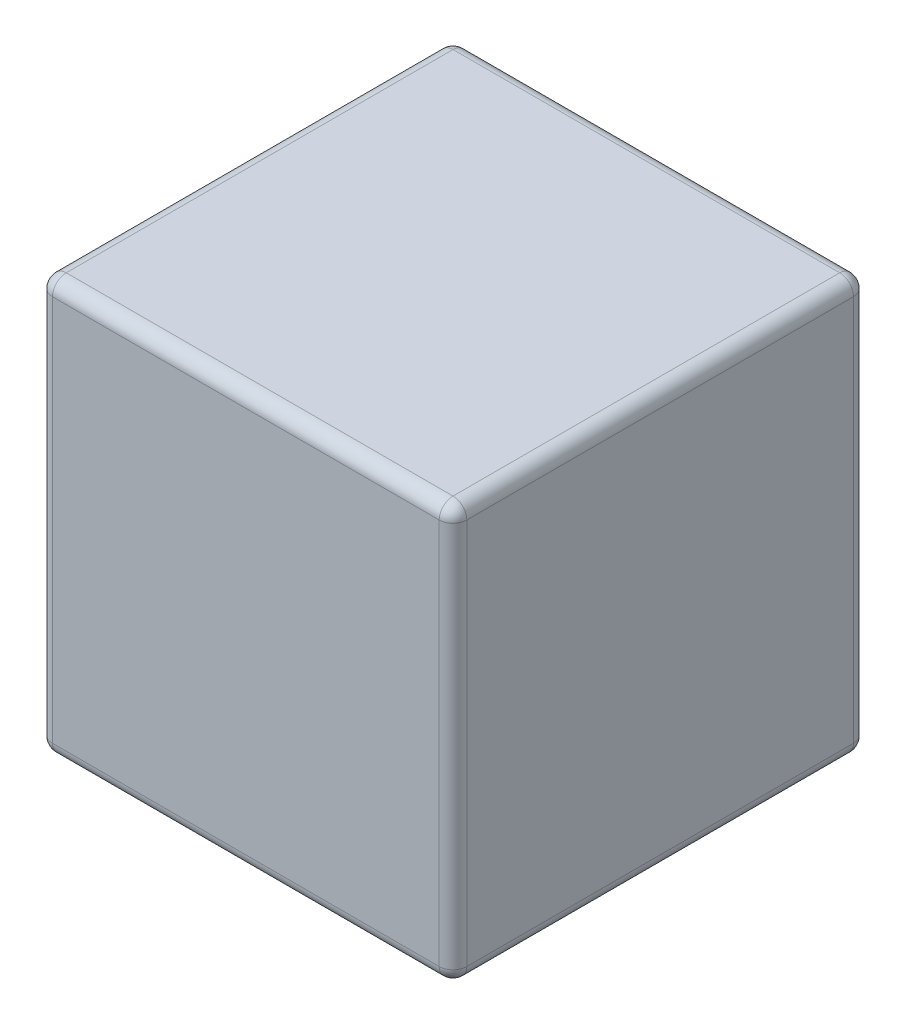
ISO-10303-21;
HEADER;
FILE_DESCRIPTION(('STEP AP214'),'2;1');
FILE_NAME('part.step','',(''),(''),'','','');
FILE_SCHEMA(('AUTOMOTIVE_DESIGN { 1 0 10303 214 1 1 1 1 }'));
ENDSEC;
DATA;
#1=APPLICATION_CONTEXT('core data for automotive mechanical design processes');
#2=APPLICATION_PROTOCOL_DEFINITION('international standard','automotive_design',2000,#1);
#3=PRODUCT_CONTEXT('',#1,'mechanical');
#4=PRODUCT('Part','Part','',(#3));
#5=PRODUCT_RELATED_PRODUCT_CATEGORY('part','',(#4));
#6=PRODUCT_DEFINITION_FORMATION('','',#4);
#7=PRODUCT_DEFINITION_CONTEXT('part definition',#1,'design');
#8=PRODUCT_DEFINITION('design','',#6,#7);
#9=PRODUCT_DEFINITION_SHAPE('','',#8);
#10=(LENGTH_UNIT() NAMED_UNIT(*) SI_UNIT(.MILLI.,.METRE.));
#11=(NAMED_UNIT(*) PLANE_ANGLE_UNIT() SI_UNIT($,.RADIAN.));
#12=(NAMED_UNIT(*) SI_UNIT($,.STERADIAN.) SOLID_ANGLE_UNIT());
#13=UNCERTAINTY_MEASURE_WITH_UNIT(LENGTH_MEASURE(1.E-05),#10,'distance_accuracy_value','');
#14=(GEOMETRIC_REPRESENTATION_CONTEXT(3) GLOBAL_UNCERTAINTY_ASSIGNED_CONTEXT((#13)) GLOBAL_UNIT_ASSIGNED_CONTEXT((#10,
#11,#12)) REPRESENTATION_CONTEXT('',''));
#15=CARTESIAN_POINT('',(0.,0.,0.));
#16=DIRECTION('',(0.,0.,1.));
#17=DIRECTION('',(1.,0.,0.));
#18=AXIS2_PLACEMENT_3D('',#15,#16,#17);
#19=CARTESIAN_POINT('',(15.,15.,30.));
#20=DIRECTION('',(-1.,0.,0.));
#21=DIRECTION('',(0.,-1.,0.));
#22=AXIS2_PLACEMENT_3D('',#19,#20,#21);
#23=PLANE('',#22);
#24=DIRECTION('',(0.,1.,0.));
#25=VECTOR('',#24,1.);
#26=CARTESIAN_POINT('',(15.,-15.,29.));
#27=LINE('',#26,#25);
#28=CARTESIAN_POINT('',(15.,14.,29.));
#29=VERTEX_POINT('',#28);
#30=CARTESIAN_POINT('',(15.,-14.,29.));
#31=VERTEX_POINT('',#30);
#32=EDGE_CURVE('E188',#29,#31,#27,.F.);
#33=ORIENTED_EDGE('',*,*,#32,.T.);
#34=DIRECTION('',(0.,0.,-1.));
#35=VECTOR('',#34,1.);
#36=CARTESIAN_POINT('',(15.,-14.,30.));
#37=LINE('',#36,#35);
#38=CARTESIAN_POINT('',(15.,-14.,1.));
#39=VERTEX_POINT('',#38);
#40=EDGE_CURVE('E190',#31,#39,#37,.T.);
#41=ORIENTED_EDGE('',*,*,#40,.T.);
#42=DIRECTION('',(0.,1.,0.));
#43=VECTOR('',#42,1.);
#44=CARTESIAN_POINT('',(15.,15.,1.));
#45=LINE('',#44,#43);
#46=CARTESIAN_POINT('',(15.,14.,1.));
#47=VERTEX_POINT('',#46);
#48=EDGE_CURVE('E186',#39,#47,#45,.T.);
#49=ORIENTED_EDGE('',*,*,#48,.T.);
#50=DIRECTION('',(0.,0.,-1.));
#51=VECTOR('',#50,1.);
#52=CARTESIAN_POINT('',(15.,14.,30.));
#53=LINE('',#52,#51);
#54=EDGE_CURVE('E184',#47,#29,#53,.F.);
#55=ORIENTED_EDGE('',*,*,#54,.T.);
#56=EDGE_LOOP('',(#33,#41,#49,#55));
#57=FACE_BOUND('',#56,.T.);
#58=ADVANCED_FACE('F32',(#57),#23,.F.);
#59=CARTESIAN_POINT('',(-15.,15.,30.));
#60=DIRECTION('',(0.,-1.,0.));
#61=DIRECTION('',(0.,0.,-1.));
#62=AXIS2_PLACEMENT_3D('',#59,#60,#61);
#63=PLANE('',#62);
#64=DIRECTION('',(-1.,0.,0.));
#65=VECTOR('',#64,1.);
#66=CARTESIAN_POINT('',(15.,15.,29.));
#67=LINE('',#66,#65);
#68=CARTESIAN_POINT('',(-14.,15.,29.));
#69=VERTEX_POINT('',#68);
#70=CARTESIAN_POINT('',(14.,15.,29.));
#71=VERTEX_POINT('',#70);
#72=EDGE_CURVE('E41',#69,#71,#67,.F.);
#73=ORIENTED_EDGE('',*,*,#72,.T.);
#74=DIRECTION('',(0.,0.,-1.));
#75=VECTOR('',#74,1.);
#76=CARTESIAN_POINT('',(14.,15.,30.));
#77=LINE('',#76,#75);
#78=CARTESIAN_POINT('',(14.,15.,1.));
#79=VERTEX_POINT('',#78);
#80=EDGE_CURVE('E11',#71,#79,#77,.T.);
#81=ORIENTED_EDGE('',*,*,#80,.T.);
#82=DIRECTION('',(-1.,0.,0.));
#83=VECTOR('',#82,1.);
#84=CARTESIAN_POINT('',(-15.,15.,1.));
#85=LINE('',#84,#83);
#86=CARTESIAN_POINT('',(-14.,15.,1.));
#87=VERTEX_POINT('',#86);
#88=EDGE_CURVE('E193',#79,#87,#85,.T.);
#89=ORIENTED_EDGE('',*,*,#88,.T.);
#90=DIRECTION('',(0.,0.,-1.));
#91=VECTOR('',#90,1.);
#92=CARTESIAN_POINT('',(-14.,15.,30.));
#93=LINE('',#92,#91);
#94=EDGE_CURVE('E52',#87,#69,#93,.F.);
#95=ORIENTED_EDGE('',*,*,#94,.T.);
#96=EDGE_LOOP('',(#73,#81,#89,#95));
#97=FACE_BOUND('',#96,.T.);
#98=ADVANCED_FACE('F295',(#97),#63,.F.);
#99=CARTESIAN_POINT('',(-15.,15.,30.));
#100=DIRECTION('',(1.,0.,0.));
#101=DIRECTION('',(0.,1.,0.));
#102=AXIS2_PLACEMENT_3D('',#99,#100,#101);
#103=PLANE('',#102);
#104=DIRECTION('',(0.,-1.,0.));
#105=VECTOR('',#104,1.);
#106=CARTESIAN_POINT('',(-15.,15.,1.));
#107=LINE('',#106,#105);
#108=CARTESIAN_POINT('',(-15.,14.,1.));
#109=VERTEX_POINT('',#108);
#110=CARTESIAN_POINT('',(-15.,-14.,1.));
#111=VERTEX_POINT('',#110);
#112=EDGE_CURVE('E170',#109,#111,#107,.T.);
#113=ORIENTED_EDGE('',*,*,#112,.T.);
#114=DIRECTION('',(0.,0.,-1.));
#115=VECTOR('',#114,1.);
#116=CARTESIAN_POINT('',(-15.,-14.,30.));
#117=LINE('',#116,#115);
#118=CARTESIAN_POINT('',(-15.,-14.,29.));
#119=VERTEX_POINT('',#118);
#120=EDGE_CURVE('E172',#111,#119,#117,.F.);
#121=ORIENTED_EDGE('',*,*,#120,.T.);
#122=DIRECTION('',(0.,-1.,0.));
#123=VECTOR('',#122,1.);
#124=CARTESIAN_POINT('',(-15.,15.,29.));
#125=LINE('',#124,#123);
#126=CARTESIAN_POINT('',(-15.,14.,29.));
#127=VERTEX_POINT('',#126);
#128=EDGE_CURVE('E168',#119,#127,#125,.F.);
#129=ORIENTED_EDGE('',*,*,#128,.T.);
#130=DIRECTION('',(0.,0.,-1.));
#131=VECTOR('',#130,1.);
#132=CARTESIAN_POINT('',(-15.,14.,30.));
#133=LINE('',#132,#131);
#134=EDGE_CURVE('E166',#127,#109,#133,.T.);
#135=ORIENTED_EDGE('',*,*,#134,.T.);
#136=EDGE_LOOP('',(#113,#121,#129,#135));
#137=FACE_BOUND('',#136,.T.);
#138=ADVANCED_FACE('F267',(#137),#103,.F.);
#139=CARTESIAN_POINT('',(-15.,-15.,30.));
#140=DIRECTION('',(0.,1.,0.));
#141=DIRECTION('',(0.,0.,1.));
#142=AXIS2_PLACEMENT_3D('',#139,#140,#141);
#143=PLANE('',#142);
#144=DIRECTION('',(0.,0.,-1.));
#145=VECTOR('',#144,1.);
#146=CARTESIAN_POINT('',(-14.,-15.,30.));
#147=LINE('',#146,#145);
#148=CARTESIAN_POINT('',(-14.,-15.,29.));
#149=VERTEX_POINT('',#148);
#150=CARTESIAN_POINT('',(-14.,-15.,1.));
#151=VERTEX_POINT('',#150);
#152=EDGE_CURVE('E153',#149,#151,#147,.T.);
#153=ORIENTED_EDGE('',*,*,#152,.T.);
#154=DIRECTION('',(1.,0.,0.));
#155=VECTOR('',#154,1.);
#156=CARTESIAN_POINT('',(-15.,-15.,1.));
#157=LINE('',#156,#155);
#158=CARTESIAN_POINT('',(14.,-15.,1.));
#159=VERTEX_POINT('',#158);
#160=EDGE_CURVE('E125',#151,#159,#157,.T.);
#161=ORIENTED_EDGE('',*,*,#160,.T.);
#162=DIRECTION('',(0.,0.,-1.));
#163=VECTOR('',#162,1.);
#164=CARTESIAN_POINT('',(14.,-15.,30.));
#165=LINE('',#164,#163);
#166=CARTESIAN_POINT('',(14.,-15.,29.));
#167=VERTEX_POINT('',#166);
#168=EDGE_CURVE('E143',#159,#167,#165,.F.);
#169=ORIENTED_EDGE('',*,*,#168,.T.);
#170=DIRECTION('',(1.,0.,0.));
#171=VECTOR('',#170,1.);
#172=CARTESIAN_POINT('',(-15.,-15.,29.));
#173=LINE('',#172,#171);
#174=EDGE_CURVE('E149',#167,#149,#173,.F.);
#175=ORIENTED_EDGE('',*,*,#174,.T.);
#176=EDGE_LOOP('',(#153,#161,#169,#175));
#177=FACE_BOUND('',#176,.T.);
#178=ADVANCED_FACE('F151',(#177),#143,.F.);
#179=CARTESIAN_POINT('',(0.,0.,30.));
#180=DIRECTION('',(0.,0.,1.));
#181=DIRECTION('',(1.,0.,0.));
#182=AXIS2_PLACEMENT_3D('',#179,#180,#181);
#183=PLANE('',#182);
#184=DIRECTION('',(0.,-1.,0.));
#185=VECTOR('',#184,1.);
#186=CARTESIAN_POINT('',(-14.,-15.,30.));
#187=LINE('',#186,#185);
#188=CARTESIAN_POINT('',(-14.,14.,30.));
#189=VERTEX_POINT('',#188);
#190=CARTESIAN_POINT('',(-14.,-14.,30.));
#191=VERTEX_POINT('',#190);
#192=EDGE_CURVE('E179',#189,#191,#187,.T.);
#193=ORIENTED_EDGE('',*,*,#192,.T.);
#194=DIRECTION('',(1.,0.,0.));
#195=VECTOR('',#194,1.);
#196=CARTESIAN_POINT('',(15.,-14.,30.));
#197=LINE('',#196,#195);
#198=CARTESIAN_POINT('',(14.,-14.,30.));
#199=VERTEX_POINT('',#198);
#200=EDGE_CURVE('E181',#191,#199,#197,.T.);
#201=ORIENTED_EDGE('',*,*,#200,.T.);
#202=DIRECTION('',(0.,1.,0.));
#203=VECTOR('',#202,1.);
#204=CARTESIAN_POINT('',(14.,15.,30.));
#205=LINE('',#204,#203);
#206=CARTESIAN_POINT('',(14.,14.,30.));
#207=VERTEX_POINT('',#206);
#208=EDGE_CURVE('E177',#199,#207,#205,.T.);
#209=ORIENTED_EDGE('',*,*,#208,.T.);
#210=DIRECTION('',(-1.,0.,0.));
#211=VECTOR('',#210,1.);
#212=CARTESIAN_POINT('',(-15.,14.,30.));
#213=LINE('',#212,#211);
#214=EDGE_CURVE('E175',#207,#189,#213,.T.);
#215=ORIENTED_EDGE('',*,*,#214,.T.);
#216=EDGE_LOOP('',(#193,#201,#209,#215));
#217=FACE_BOUND('',#216,.T.);
#218=ADVANCED_FACE('F276',(#217),#183,.T.);
#219=CARTESIAN_POINT('',(0.,0.,0.));
#220=DIRECTION('',(0.,0.,1.));
#221=DIRECTION('',(1.,0.,0.));
#222=AXIS2_PLACEMENT_3D('',#219,#220,#221);
#223=PLANE('',#222);
#224=DIRECTION('',(0.,1.,0.));
#225=VECTOR('',#224,1.);
#226=CARTESIAN_POINT('',(14.,0.,0.));
#227=LINE('',#226,#225);
#228=CARTESIAN_POINT('',(14.,14.,0.));
#229=VERTEX_POINT('',#228);
#230=CARTESIAN_POINT('',(14.,-14.,0.));
#231=VERTEX_POINT('',#230);
#232=EDGE_CURVE('E157',#229,#231,#227,.F.);
#233=ORIENTED_EDGE('',*,*,#232,.T.);
#234=DIRECTION('',(1.,0.,0.));
#235=VECTOR('',#234,1.);
#236=CARTESIAN_POINT('',(0.,-14.,0.));
#237=LINE('',#236,#235);
#238=CARTESIAN_POINT('',(-14.,-14.,0.));
#239=VERTEX_POINT('',#238);
#240=EDGE_CURVE('E127',#231,#239,#237,.F.);
#241=ORIENTED_EDGE('',*,*,#240,.T.);
#242=DIRECTION('',(0.,-1.,0.));
#243=VECTOR('',#242,1.);
#244=CARTESIAN_POINT('',(-14.,0.,0.));
#245=LINE('',#244,#243);
#246=CARTESIAN_POINT('',(-14.,14.,0.));
#247=VERTEX_POINT('',#246);
#248=EDGE_CURVE('E163',#239,#247,#245,.F.);
#249=ORIENTED_EDGE('',*,*,#248,.T.);
#250=DIRECTION('',(-1.,0.,0.));
#251=VECTOR('',#250,1.);
#252=CARTESIAN_POINT('',(0.,14.,0.));
#253=LINE('',#252,#251);
#254=EDGE_CURVE('E155',#247,#229,#253,.F.);
#255=ORIENTED_EDGE('',*,*,#254,.T.);
#256=EDGE_LOOP('',(#233,#241,#249,#255));
#257=FACE_BOUND('',#256,.T.);
#258=ADVANCED_FACE('F355',(#257),#223,.F.);
#259=CARTESIAN_POINT('',(0.,14.,29.));
#260=DIRECTION('',(1.,0.,0.));
#261=DIRECTION('',(0.,0.,-1.));
#262=AXIS2_PLACEMENT_3D('',#259,#260,#261);
#263=CYLINDRICAL_SURFACE('',#262,1.);
#264=CARTESIAN_POINT('',(-14.,14.,29.));
#265=DIRECTION('',(-1.,0.,0.));
#266=DIRECTION('',(0.,0.,1.));
#267=AXIS2_PLACEMENT_3D('',#264,#265,#266);
#268=CIRCLE('',#267,1.);
#269=EDGE_CURVE('E36',#189,#69,#268,.T.);
#270=ORIENTED_EDGE('',*,*,#269,.F.);
#271=ORIENTED_EDGE('',*,*,#214,.F.);
#272=CARTESIAN_POINT('',(14.,14.,29.));
#273=DIRECTION('',(1.,0.,0.));
#274=DIRECTION('',(0.,0.,-1.));
#275=AXIS2_PLACEMENT_3D('',#272,#273,#274);
#276=CIRCLE('',#275,1.);
#277=EDGE_CURVE('E246',#71,#207,#276,.T.);
#278=ORIENTED_EDGE('',*,*,#277,.F.);
#279=ORIENTED_EDGE('',*,*,#72,.F.);
#280=EDGE_LOOP('',(#270,#271,#278,#279));
#281=FACE_BOUND('',#280,.T.);
#282=ADVANCED_FACE('F34',(#281),#263,.T.);
#283=CARTESIAN_POINT('',(-14.,14.,29.));
#284=DIRECTION('',(0.,1.,0.));
#285=DIRECTION('',(0.,0.,1.));
#286=AXIS2_PLACEMENT_3D('',#283,#284,#285);
#287=SPHERICAL_SURFACE('',#286,1.);
#288=CARTESIAN_POINT('',(-14.,14.,29.));
#289=DIRECTION('',(0.,1.,0.));
#290=DIRECTION('',(0.,0.,1.));
#291=AXIS2_PLACEMENT_3D('',#288,#289,#290);
#292=CIRCLE('',#291,1.);
#293=EDGE_CURVE('E241',#189,#127,#292,.F.);
#294=ORIENTED_EDGE('',*,*,#293,.F.);
#295=ORIENTED_EDGE('',*,*,#269,.T.);
#296=CARTESIAN_POINT('',(-14.,14.,29.));
#297=DIRECTION('',(0.,0.,1.));
#298=DIRECTION('',(1.,0.,0.));
#299=AXIS2_PLACEMENT_3D('',#296,#297,#298);
#300=CIRCLE('',#299,1.);
#301=EDGE_CURVE('E244',#127,#69,#300,.F.);
#302=ORIENTED_EDGE('',*,*,#301,.F.);
#303=EDGE_LOOP('',(#294,#295,#302));
#304=FACE_BOUND('',#303,.T.);
#305=ADVANCED_FACE('F256',(#304),#287,.T.);
#306=CARTESIAN_POINT('',(14.,14.,29.));
#307=DIRECTION('',(0.,0.,1.));
#308=DIRECTION('',(1.,0.,0.));
#309=AXIS2_PLACEMENT_3D('',#306,#307,#308);
#310=SPHERICAL_SURFACE('',#309,1.);
#311=CARTESIAN_POINT('',(14.,14.,29.));
#312=DIRECTION('',(0.,0.,1.));
#313=DIRECTION('',(1.,0.,0.));
#314=AXIS2_PLACEMENT_3D('',#311,#312,#313);
#315=CIRCLE('',#314,1.);
#316=EDGE_CURVE('E235',#71,#29,#315,.F.);
#317=ORIENTED_EDGE('',*,*,#316,.F.);
#318=ORIENTED_EDGE('',*,*,#277,.T.);
#319=CARTESIAN_POINT('',(14.,14.,29.));
#320=DIRECTION('',(0.,1.,0.));
#321=DIRECTION('',(0.,0.,1.));
#322=AXIS2_PLACEMENT_3D('',#319,#320,#321);
#323=CIRCLE('',#322,1.);
#324=EDGE_CURVE('E238',#29,#207,#323,.F.);
#325=ORIENTED_EDGE('',*,*,#324,.F.);
#326=EDGE_LOOP('',(#317,#318,#325));
#327=FACE_BOUND('',#326,.T.);
#328=ADVANCED_FACE('F289',(#327),#310,.T.);
#329=CARTESIAN_POINT('',(-14.,14.,30.));
#330=DIRECTION('',(0.,0.,-1.));
#331=DIRECTION('',(-1.,0.,0.));
#332=AXIS2_PLACEMENT_3D('',#329,#330,#331);
#333=CYLINDRICAL_SURFACE('',#332,1.);
#334=ORIENTED_EDGE('',*,*,#301,.T.);
#335=ORIENTED_EDGE('',*,*,#94,.F.);
#336=CARTESIAN_POINT('',(-14.,14.,1.));
#337=DIRECTION('',(0.,0.,-1.));
#338=DIRECTION('',(-1.,0.,0.));
#339=AXIS2_PLACEMENT_3D('',#336,#337,#338);
#340=CIRCLE('',#339,1.);
#341=EDGE_CURVE('E229',#109,#87,#340,.T.);
#342=ORIENTED_EDGE('',*,*,#341,.F.);
#343=ORIENTED_EDGE('',*,*,#134,.F.);
#344=EDGE_LOOP('',(#334,#335,#342,#343));
#345=FACE_BOUND('',#344,.T.);
#346=ADVANCED_FACE('F262',(#345),#333,.T.);
#347=CARTESIAN_POINT('',(-14.,0.,29.));
#348=DIRECTION('',(0.,1.,0.));
#349=DIRECTION('',(-1.,0.,0.));
#350=AXIS2_PLACEMENT_3D('',#347,#348,#349);
#351=CYLINDRICAL_SURFACE('',#350,1.);
#352=ORIENTED_EDGE('',*,*,#293,.T.);
#353=ORIENTED_EDGE('',*,*,#128,.F.);
#354=CARTESIAN_POINT('',(-14.,-14.,29.));
#355=DIRECTION('',(0.,-1.,0.));
#356=DIRECTION('',(0.,0.,-1.));
#357=AXIS2_PLACEMENT_3D('',#354,#355,#356);
#358=CIRCLE('',#357,1.);
#359=EDGE_CURVE('E226',#191,#119,#358,.T.);
#360=ORIENTED_EDGE('',*,*,#359,.F.);
#361=ORIENTED_EDGE('',*,*,#192,.F.);
#362=EDGE_LOOP('',(#352,#353,#360,#361));
#363=FACE_BOUND('',#362,.T.);
#364=ADVANCED_FACE('F273',(#363),#351,.T.);
#365=CARTESIAN_POINT('',(0.,-14.,29.));
#366=DIRECTION('',(-1.,0.,0.));
#367=DIRECTION('',(0.,0.,1.));
#368=AXIS2_PLACEMENT_3D('',#365,#366,#367);
#369=CYLINDRICAL_SURFACE('',#368,1.);
#370=CARTESIAN_POINT('',(14.,-14.,29.));
#371=DIRECTION('',(1.,0.,0.));
#372=DIRECTION('',(0.,0.,-1.));
#373=AXIS2_PLACEMENT_3D('',#370,#371,#372);
#374=CIRCLE('',#373,1.);
#375=EDGE_CURVE('E220',#199,#167,#374,.T.);
#376=ORIENTED_EDGE('',*,*,#375,.F.);
#377=ORIENTED_EDGE('',*,*,#200,.F.);
#378=CARTESIAN_POINT('',(-14.,-14.,29.));
#379=DIRECTION('',(-1.,0.,0.));
#380=DIRECTION('',(0.,0.,1.));
#381=AXIS2_PLACEMENT_3D('',#378,#379,#380);
#382=CIRCLE('',#381,1.);
#383=EDGE_CURVE('E223',#149,#191,#382,.T.);
#384=ORIENTED_EDGE('',*,*,#383,.F.);
#385=ORIENTED_EDGE('',*,*,#174,.F.);
#386=EDGE_LOOP('',(#376,#377,#384,#385));
#387=FACE_BOUND('',#386,.T.);
#388=ADVANCED_FACE('F280',(#387),#369,.T.);
#389=CARTESIAN_POINT('',(14.,0.,29.));
#390=DIRECTION('',(0.,-1.,0.));
#391=DIRECTION('',(1.,0.,0.));
#392=AXIS2_PLACEMENT_3D('',#389,#390,#391);
#393=CYLINDRICAL_SURFACE('',#392,1.);
#394=ORIENTED_EDGE('',*,*,#324,.T.);
#395=ORIENTED_EDGE('',*,*,#208,.F.);
#396=CARTESIAN_POINT('',(14.,-14.,29.));
#397=DIRECTION('',(0.,-1.,0.));
#398=DIRECTION('',(0.,0.,-1.));
#399=AXIS2_PLACEMENT_3D('',#396,#397,#398);
#400=CIRCLE('',#399,1.);
#401=EDGE_CURVE('E218',#31,#199,#400,.T.);
#402=ORIENTED_EDGE('',*,*,#401,.F.);
#403=ORIENTED_EDGE('',*,*,#32,.F.);
#404=EDGE_LOOP('',(#394,#395,#402,#403));
#405=FACE_BOUND('',#404,.T.);
#406=ADVANCED_FACE('F286',(#405),#393,.T.);
#407=CARTESIAN_POINT('',(14.,14.,30.));
#408=DIRECTION('',(0.,0.,-1.));
#409=DIRECTION('',(-1.,0.,0.));
#410=AXIS2_PLACEMENT_3D('',#407,#408,#409);
#411=CYLINDRICAL_SURFACE('',#410,1.);
#412=ORIENTED_EDGE('',*,*,#316,.T.);
#413=ORIENTED_EDGE('',*,*,#54,.F.);
#414=CARTESIAN_POINT('',(14.,14.,1.));
#415=DIRECTION('',(0.,0.,-1.));
#416=DIRECTION('',(-1.,0.,0.));
#417=AXIS2_PLACEMENT_3D('',#414,#415,#416);
#418=CIRCLE('',#417,1.);
#419=EDGE_CURVE('E215',#79,#47,#418,.T.);
#420=ORIENTED_EDGE('',*,*,#419,.F.);
#421=ORIENTED_EDGE('',*,*,#80,.F.);
#422=EDGE_LOOP('',(#412,#413,#420,#421));
#423=FACE_BOUND('',#422,.T.);
#424=ADVANCED_FACE('F293',(#423),#411,.T.);
#425=CARTESIAN_POINT('',(-15.,14.,1.));
#426=DIRECTION('',(-1.,0.,0.));
#427=DIRECTION('',(0.,0.,1.));
#428=AXIS2_PLACEMENT_3D('',#425,#426,#427);
#429=CYLINDRICAL_SURFACE('',#428,1.);
#430=CARTESIAN_POINT('',(-14.,14.,1.));
#431=DIRECTION('',(-1.,0.,0.));
#432=DIRECTION('',(0.,0.,1.));
#433=AXIS2_PLACEMENT_3D('',#430,#431,#432);
#434=CIRCLE('',#433,1.);
#435=EDGE_CURVE('E232',#87,#247,#434,.T.);
#436=ORIENTED_EDGE('',*,*,#435,.F.);
#437=ORIENTED_EDGE('',*,*,#88,.F.);
#438=CARTESIAN_POINT('',(14.,14.,1.));
#439=DIRECTION('',(1.,0.,0.));
#440=DIRECTION('',(0.,0.,-1.));
#441=AXIS2_PLACEMENT_3D('',#438,#439,#440);
#442=CIRCLE('',#441,1.);
#443=EDGE_CURVE('E213',#229,#79,#442,.T.);
#444=ORIENTED_EDGE('',*,*,#443,.F.);
#445=ORIENTED_EDGE('',*,*,#254,.F.);
#446=EDGE_LOOP('',(#436,#437,#444,#445));
#447=FACE_BOUND('',#446,.T.);
#448=ADVANCED_FACE('F298',(#447),#429,.T.);
#449=CARTESIAN_POINT('',(-14.,14.,1.));
#450=DIRECTION('',(0.,1.,0.));
#451=DIRECTION('',(0.,0.,1.));
#452=AXIS2_PLACEMENT_3D('',#449,#450,#451);
#453=SPHERICAL_SURFACE('',#452,1.);
#454=ORIENTED_EDGE('',*,*,#341,.T.);
#455=ORIENTED_EDGE('',*,*,#435,.T.);
#456=CARTESIAN_POINT('',(-14.,14.,1.));
#457=DIRECTION('',(0.,1.,0.));
#458=DIRECTION('',(0.,0.,1.));
#459=AXIS2_PLACEMENT_3D('',#456,#457,#458);
#460=CIRCLE('',#459,1.);
#461=EDGE_CURVE('E210',#109,#247,#460,.F.);
#462=ORIENTED_EDGE('',*,*,#461,.F.);
#463=EDGE_LOOP('',(#454,#455,#462));
#464=FACE_BOUND('',#463,.T.);
#465=ADVANCED_FACE('F302',(#464),#453,.T.);
#466=CARTESIAN_POINT('',(-14.,-14.,29.));
#467=DIRECTION('',(0.,0.,1.));
#468=DIRECTION('',(1.,0.,0.));
#469=AXIS2_PLACEMENT_3D('',#466,#467,#468);
#470=SPHERICAL_SURFACE('',#469,1.);
#471=ORIENTED_EDGE('',*,*,#383,.T.);
#472=ORIENTED_EDGE('',*,*,#359,.T.);
#473=CARTESIAN_POINT('',(-14.,-14.,29.));
#474=DIRECTION('',(0.,0.,1.));
#475=DIRECTION('',(1.,0.,0.));
#476=AXIS2_PLACEMENT_3D('',#473,#474,#475);
#477=CIRCLE('',#476,1.);
#478=EDGE_CURVE('E208',#149,#119,#477,.F.);
#479=ORIENTED_EDGE('',*,*,#478,.F.);
#480=EDGE_LOOP('',(#471,#472,#479));
#481=FACE_BOUND('',#480,.T.);
#482=ADVANCED_FACE('F313',(#481),#470,.T.);
#483=CARTESIAN_POINT('',(14.,-14.,29.));
#484=DIRECTION('',(0.,0.,1.));
#485=DIRECTION('',(1.,0.,0.));
#486=AXIS2_PLACEMENT_3D('',#483,#484,#485);
#487=SPHERICAL_SURFACE('',#486,1.);
#488=ORIENTED_EDGE('',*,*,#401,.T.);
#489=ORIENTED_EDGE('',*,*,#375,.T.);
#490=CARTESIAN_POINT('',(14.,-14.,29.));
#491=DIRECTION('',(0.,0.,1.));
#492=DIRECTION('',(1.,0.,0.));
#493=AXIS2_PLACEMENT_3D('',#490,#491,#492);
#494=CIRCLE('',#493,1.);
#495=EDGE_CURVE('E146',#31,#167,#494,.F.);
#496=ORIENTED_EDGE('',*,*,#495,.F.);
#497=EDGE_LOOP('',(#488,#489,#496));
#498=FACE_BOUND('',#497,.T.);
#499=ADVANCED_FACE('F315',(#498),#487,.T.);
#500=CARTESIAN_POINT('',(14.,14.,1.));
#501=DIRECTION('',(0.,1.,0.));
#502=DIRECTION('',(0.,0.,1.));
#503=AXIS2_PLACEMENT_3D('',#500,#501,#502);
#504=SPHERICAL_SURFACE('',#503,1.);
#505=ORIENTED_EDGE('',*,*,#443,.T.);
#506=ORIENTED_EDGE('',*,*,#419,.T.);
#507=CARTESIAN_POINT('',(14.,14.,1.));
#508=DIRECTION('',(0.,1.,0.));
#509=DIRECTION('',(0.,0.,1.));
#510=AXIS2_PLACEMENT_3D('',#507,#508,#509);
#511=CIRCLE('',#510,1.);
#512=EDGE_CURVE('E204',#229,#47,#511,.F.);
#513=ORIENTED_EDGE('',*,*,#512,.F.);
#514=EDGE_LOOP('',(#505,#506,#513));
#515=FACE_BOUND('',#514,.T.);
#516=ADVANCED_FACE('F321',(#515),#504,.T.);
#517=CARTESIAN_POINT('',(-14.,15.,1.));
#518=DIRECTION('',(0.,-1.,0.));
#519=DIRECTION('',(1.,0.,0.));
#520=AXIS2_PLACEMENT_3D('',#517,#518,#519);
#521=CYLINDRICAL_SURFACE('',#520,1.);
#522=ORIENTED_EDGE('',*,*,#461,.T.);
#523=ORIENTED_EDGE('',*,*,#248,.F.);
#524=CARTESIAN_POINT('',(-14.,-14.,1.));
#525=DIRECTION('',(0.,-1.,0.));
#526=DIRECTION('',(0.,0.,-1.));
#527=AXIS2_PLACEMENT_3D('',#524,#525,#526);
#528=CIRCLE('',#527,1.);
#529=EDGE_CURVE('E201',#111,#239,#528,.T.);
#530=ORIENTED_EDGE('',*,*,#529,.F.);
#531=ORIENTED_EDGE('',*,*,#112,.F.);
#532=EDGE_LOOP('',(#522,#523,#530,#531));
#533=FACE_BOUND('',#532,.T.);
#534=ADVANCED_FACE('F306',(#533),#521,.T.);
#535=CARTESIAN_POINT('',(-14.,-14.,30.));
#536=DIRECTION('',(0.,0.,-1.));
#537=DIRECTION('',(-1.,0.,0.));
#538=AXIS2_PLACEMENT_3D('',#535,#536,#537);
#539=CYLINDRICAL_SURFACE('',#538,1.);
#540=ORIENTED_EDGE('',*,*,#478,.T.);
#541=ORIENTED_EDGE('',*,*,#120,.F.);
#542=CARTESIAN_POINT('',(-14.,-14.,1.));
#543=DIRECTION('',(0.,0.,-1.));
#544=DIRECTION('',(-1.,0.,0.));
#545=AXIS2_PLACEMENT_3D('',#542,#543,#544);
#546=CIRCLE('',#545,1.);
#547=EDGE_CURVE('E140',#151,#111,#546,.T.);
#548=ORIENTED_EDGE('',*,*,#547,.F.);
#549=ORIENTED_EDGE('',*,*,#152,.F.);
#550=EDGE_LOOP('',(#540,#541,#548,#549));
#551=FACE_BOUND('',#550,.T.);
#552=ADVANCED_FACE('F311',(#551),#539,.T.);
#553=CARTESIAN_POINT('',(14.,-14.,30.));
#554=DIRECTION('',(0.,0.,-1.));
#555=DIRECTION('',(-1.,0.,0.));
#556=AXIS2_PLACEMENT_3D('',#553,#554,#555);
#557=CYLINDRICAL_SURFACE('',#556,1.);
#558=ORIENTED_EDGE('',*,*,#495,.T.);
#559=ORIENTED_EDGE('',*,*,#168,.F.);
#560=CARTESIAN_POINT('',(14.,-14.,1.));
#561=DIRECTION('',(0.,0.,-1.));
#562=DIRECTION('',(-1.,0.,0.));
#563=AXIS2_PLACEMENT_3D('',#560,#561,#562);
#564=CIRCLE('',#563,1.);
#565=EDGE_CURVE('E132',#39,#159,#564,.T.);
#566=ORIENTED_EDGE('',*,*,#565,.F.);
#567=ORIENTED_EDGE('',*,*,#40,.F.);
#568=EDGE_LOOP('',(#558,#559,#566,#567));
#569=FACE_BOUND('',#568,.T.);
#570=ADVANCED_FACE('F144',(#569),#557,.T.);
#571=CARTESIAN_POINT('',(14.,15.,1.));
#572=DIRECTION('',(0.,1.,0.));
#573=DIRECTION('',(-1.,0.,0.));
#574=AXIS2_PLACEMENT_3D('',#571,#572,#573);
#575=CYLINDRICAL_SURFACE('',#574,1.);
#576=ORIENTED_EDGE('',*,*,#512,.T.);
#577=ORIENTED_EDGE('',*,*,#48,.F.);
#578=CARTESIAN_POINT('',(14.,-14.,1.));
#579=DIRECTION('',(0.,-1.,0.));
#580=DIRECTION('',(1.,0.,0.));
#581=AXIS2_PLACEMENT_3D('',#578,#579,#580);
#582=CIRCLE('',#581,1.);
#583=EDGE_CURVE('E136',#231,#39,#582,.T.);
#584=ORIENTED_EDGE('',*,*,#583,.F.);
#585=ORIENTED_EDGE('',*,*,#232,.F.);
#586=EDGE_LOOP('',(#576,#577,#584,#585));
#587=FACE_BOUND('',#586,.T.);
#588=ADVANCED_FACE('F339',(#587),#575,.T.);
#589=CARTESIAN_POINT('',(-14.,-14.,1.));
#590=DIRECTION('',(-1.,0.,0.));
#591=DIRECTION('',(0.,0.,1.));
#592=AXIS2_PLACEMENT_3D('',#589,#590,#591);
#593=SPHERICAL_SURFACE('',#592,1.);
#594=ORIENTED_EDGE('',*,*,#547,.T.);
#595=ORIENTED_EDGE('',*,*,#529,.T.);
#596=CARTESIAN_POINT('',(-14.,-14.,1.));
#597=DIRECTION('',(-1.,0.,0.));
#598=DIRECTION('',(0.,0.,1.));
#599=AXIS2_PLACEMENT_3D('',#596,#597,#598);
#600=CIRCLE('',#599,1.);
#601=EDGE_CURVE('E129',#151,#239,#600,.F.);
#602=ORIENTED_EDGE('',*,*,#601,.F.);
#603=EDGE_LOOP('',(#594,#595,#602));
#604=FACE_BOUND('',#603,.T.);
#605=ADVANCED_FACE('F309',(#604),#593,.T.);
#606=CARTESIAN_POINT('',(14.,-14.,1.));
#607=DIRECTION('',(1.,0.,0.));
#608=DIRECTION('',(0.,1.,0.));
#609=AXIS2_PLACEMENT_3D('',#606,#607,#608);
#610=SPHERICAL_SURFACE('',#609,1.);
#611=ORIENTED_EDGE('',*,*,#583,.T.);
#612=ORIENTED_EDGE('',*,*,#565,.T.);
#613=CARTESIAN_POINT('',(14.,-14.,1.));
#614=DIRECTION('',(1.,0.,0.));
#615=DIRECTION('',(0.,0.,-1.));
#616=AXIS2_PLACEMENT_3D('',#613,#614,#615);
#617=CIRCLE('',#616,1.);
#618=EDGE_CURVE('E121',#231,#159,#617,.F.);
#619=ORIENTED_EDGE('',*,*,#618,.F.);
#620=EDGE_LOOP('',(#611,#612,#619));
#621=FACE_BOUND('',#620,.T.);
#622=ADVANCED_FACE('F134',(#621),#610,.T.);
#623=CARTESIAN_POINT('',(-15.,-14.,1.));
#624=DIRECTION('',(1.,0.,0.));
#625=DIRECTION('',(0.,0.,-1.));
#626=AXIS2_PLACEMENT_3D('',#623,#624,#625);
#627=CYLINDRICAL_SURFACE('',#626,1.);
#628=ORIENTED_EDGE('',*,*,#601,.T.);
#629=ORIENTED_EDGE('',*,*,#240,.F.);
#630=ORIENTED_EDGE('',*,*,#618,.T.);
#631=ORIENTED_EDGE('',*,*,#160,.F.);
#632=EDGE_LOOP('',(#628,#629,#630,#631));
#633=FACE_BOUND('',#632,.T.);
#634=ADVANCED_FACE('F123',(#633),#627,.T.);
#635=CLOSED_SHELL('',(#58,#98,#138,#178,#218,#258,#282,#305,#328,#346,#364,#388,#406,#424,#448,
#465,#482,#499,#516,#534,#552,#570,#588,#605,#622,#634));
#636=MANIFOLD_SOLID_BREP('B2',#635);
#637=ADVANCED_BREP_SHAPE_REPRESENTATION('',(#18,#636),#14);
#638=SHAPE_DEFINITION_REPRESENTATION(#9,#637);
ENDSEC;
END-ISO-10303-21;
